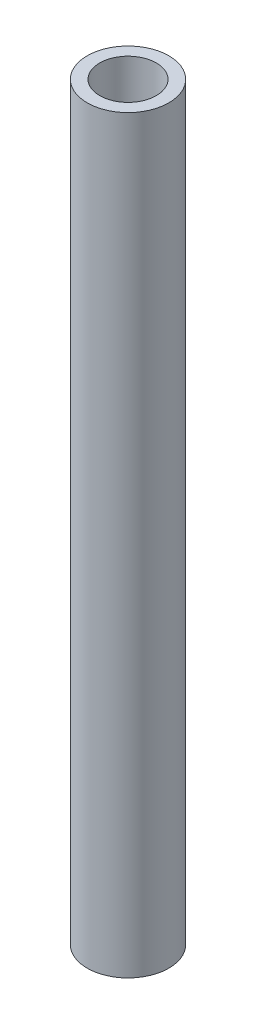
ISO-10303-21;
HEADER;
FILE_DESCRIPTION(('STEP AP214'),'2;1');
FILE_NAME('part.step','',(''),(''),'','','');
FILE_SCHEMA(('AUTOMOTIVE_DESIGN { 1 0 10303 214 1 1 1 1 }'));
ENDSEC;
DATA;
#1=APPLICATION_CONTEXT('core data for automotive mechanical design processes');
#2=APPLICATION_PROTOCOL_DEFINITION('international standard','automotive_design',2000,#1);
#3=PRODUCT_CONTEXT('',#1,'mechanical');
#4=PRODUCT('Part','Part','',(#3));
#5=PRODUCT_RELATED_PRODUCT_CATEGORY('part','',(#4));
#6=PRODUCT_DEFINITION_FORMATION('','',#4);
#7=PRODUCT_DEFINITION_CONTEXT('part definition',#1,'design');
#8=PRODUCT_DEFINITION('design','',#6,#7);
#9=PRODUCT_DEFINITION_SHAPE('','',#8);
#10=(LENGTH_UNIT() NAMED_UNIT(*) SI_UNIT(.MILLI.,.METRE.));
#11=(NAMED_UNIT(*) PLANE_ANGLE_UNIT() SI_UNIT($,.RADIAN.));
#12=(NAMED_UNIT(*) SI_UNIT($,.STERADIAN.) SOLID_ANGLE_UNIT());
#13=UNCERTAINTY_MEASURE_WITH_UNIT(LENGTH_MEASURE(1.E-05),#10,'distance_accuracy_value','');
#14=(GEOMETRIC_REPRESENTATION_CONTEXT(3) GLOBAL_UNCERTAINTY_ASSIGNED_CONTEXT((#13)) GLOBAL_UNIT_ASSIGNED_CONTEXT((#10,
#11,#12)) REPRESENTATION_CONTEXT('',''));
#15=CARTESIAN_POINT('',(0.,0.,0.));
#16=DIRECTION('',(0.,0.,1.));
#17=DIRECTION('',(1.,0.,0.));
#18=AXIS2_PLACEMENT_3D('',#15,#16,#17);
#19=CARTESIAN_POINT('',(0.,152.4,0.));
#20=DIRECTION('',(0.,1.,0.));
#21=DIRECTION('',(0.,0.,1.));
#22=AXIS2_PLACEMENT_3D('',#19,#20,#21);
#23=PLANE('',#22);
#24=CARTESIAN_POINT('',(0.,152.4,0.));
#25=DIRECTION('',(0.,1.,0.));
#26=DIRECTION('',(0.,0.,1.));
#27=AXIS2_PLACEMENT_3D('',#24,#25,#26);
#28=CIRCLE('',#27,16.5989);
#29=CARTESIAN_POINT('',(0.,152.4,-16.5989));
#30=VERTEX_POINT('',#29);
#31=EDGE_CURVE('E10',#30,#30,#28,.T.);
#32=ORIENTED_EDGE('',*,*,#31,.T.);
#33=EDGE_LOOP('',(#32));
#34=FACE_BOUND('',#33,.T.);
#35=CARTESIAN_POINT('',(0.,152.4,0.));
#36=DIRECTION('',(0.,1.,0.));
#37=DIRECTION('',(0.,0.,1.));
#38=AXIS2_PLACEMENT_3D('',#35,#36,#37);
#39=CIRCLE('',#38,11.5189);
#40=CARTESIAN_POINT('',(0.,152.4,-11.5189));
#41=VERTEX_POINT('',#40);
#42=EDGE_CURVE('E41',#41,#41,#39,.T.);
#43=ORIENTED_EDGE('',*,*,#42,.F.);
#44=EDGE_LOOP('',(#43));
#45=FACE_BOUND('',#44,.T.);
#46=ADVANCED_FACE('F30',(#34,#45),#23,.T.);
#47=CARTESIAN_POINT('',(0.,-152.4,0.));
#48=DIRECTION('',(0.,1.,0.));
#49=DIRECTION('',(0.,0.,1.));
#50=AXIS2_PLACEMENT_3D('',#47,#48,#49);
#51=PLANE('',#50);
#52=CARTESIAN_POINT('',(0.,-152.4,0.));
#53=DIRECTION('',(0.,1.,0.));
#54=DIRECTION('',(0.,0.,1.));
#55=AXIS2_PLACEMENT_3D('',#52,#53,#54);
#56=CIRCLE('',#55,16.5989);
#57=CARTESIAN_POINT('',(0.,-152.4,-16.5989));
#58=VERTEX_POINT('',#57);
#59=EDGE_CURVE('E34',#58,#58,#56,.T.);
#60=ORIENTED_EDGE('',*,*,#59,.F.);
#61=EDGE_LOOP('',(#60));
#62=FACE_BOUND('',#61,.T.);
#63=CARTESIAN_POINT('',(0.,-152.4,0.));
#64=DIRECTION('',(0.,1.,0.));
#65=DIRECTION('',(0.,0.,1.));
#66=AXIS2_PLACEMENT_3D('',#63,#64,#65);
#67=CIRCLE('',#66,11.5189);
#68=CARTESIAN_POINT('',(0.,-152.4,-11.5189));
#69=VERTEX_POINT('',#68);
#70=EDGE_CURVE('E43',#69,#69,#67,.T.);
#71=ORIENTED_EDGE('',*,*,#70,.T.);
#72=EDGE_LOOP('',(#71));
#73=FACE_BOUND('',#72,.T.);
#74=ADVANCED_FACE('F53',(#62,#73),#51,.F.);
#75=CARTESIAN_POINT('',(0.,152.4,0.));
#76=DIRECTION('',(0.,-1.,0.));
#77=DIRECTION('',(0.,0.,-1.));
#78=AXIS2_PLACEMENT_3D('',#75,#76,#77);
#79=CYLINDRICAL_SURFACE('',#78,16.5989);
#80=CARTESIAN_POINT('',(0.,152.4,-16.5989));
#81=CARTESIAN_POINT('',(0.,149.225,-16.5989));
#82=CARTESIAN_POINT('',(0.,146.05,-16.5989));
#83=CARTESIAN_POINT('',(0.,139.7,-16.5989));
#84=CARTESIAN_POINT('',(0.,136.525,-16.5989));
#85=CARTESIAN_POINT('',(0.,130.175,-16.5989));
#86=CARTESIAN_POINT('',(0.,127.,-16.5989));
#87=CARTESIAN_POINT('',(0.,120.65,-16.5989));
#88=CARTESIAN_POINT('',(0.,117.475,-16.5989));
#89=CARTESIAN_POINT('',(0.,111.125,-16.5989));
#90=CARTESIAN_POINT('',(0.,107.95,-16.5989));
#91=CARTESIAN_POINT('',(0.,101.6,-16.5989));
#92=CARTESIAN_POINT('',(0.,98.425,-16.5989));
#93=CARTESIAN_POINT('',(0.,92.075,-16.5989));
#94=CARTESIAN_POINT('',(0.,88.9,-16.5989));
#95=CARTESIAN_POINT('',(0.,82.55,-16.5989));
#96=CARTESIAN_POINT('',(0.,79.375,-16.5989));
#97=CARTESIAN_POINT('',(0.,73.025,-16.5989));
#98=CARTESIAN_POINT('',(0.,69.85,-16.5989));
#99=CARTESIAN_POINT('',(0.,63.5,-16.5989));
#100=CARTESIAN_POINT('',(0.,60.325,-16.5989));
#101=CARTESIAN_POINT('',(0.,53.975,-16.5989));
#102=CARTESIAN_POINT('',(0.,50.8,-16.5989));
#103=CARTESIAN_POINT('',(0.,44.45,-16.5989));
#104=CARTESIAN_POINT('',(0.,41.275,-16.5989));
#105=CARTESIAN_POINT('',(0.,34.925,-16.5989));
#106=CARTESIAN_POINT('',(0.,31.75,-16.5989));
#107=CARTESIAN_POINT('',(0.,25.4,-16.5989));
#108=CARTESIAN_POINT('',(0.,22.225,-16.5989));
#109=CARTESIAN_POINT('',(0.,15.875,-16.5989));
#110=CARTESIAN_POINT('',(0.,12.7,-16.5989));
#111=CARTESIAN_POINT('',(0.,6.35,-16.5989));
#112=CARTESIAN_POINT('',(0.,3.175,-16.5989));
#113=CARTESIAN_POINT('',(0.,-3.175,-16.5989));
#114=CARTESIAN_POINT('',(0.,-6.35,-16.5989));
#115=CARTESIAN_POINT('',(0.,-12.7,-16.5989));
#116=CARTESIAN_POINT('',(0.,-15.875,-16.5989));
#117=CARTESIAN_POINT('',(0.,-22.225,-16.5989));
#118=CARTESIAN_POINT('',(0.,-25.4,-16.5989));
#119=CARTESIAN_POINT('',(0.,-31.75,-16.5989));
#120=CARTESIAN_POINT('',(0.,-34.925,-16.5989));
#121=CARTESIAN_POINT('',(0.,-41.275,-16.5989));
#122=CARTESIAN_POINT('',(0.,-44.45,-16.5989));
#123=CARTESIAN_POINT('',(0.,-50.8,-16.5989));
#124=CARTESIAN_POINT('',(0.,-53.975,-16.5989));
#125=CARTESIAN_POINT('',(0.,-60.325,-16.5989));
#126=CARTESIAN_POINT('',(0.,-63.5,-16.5989));
#127=CARTESIAN_POINT('',(0.,-69.85,-16.5989));
#128=CARTESIAN_POINT('',(0.,-73.025,-16.5989));
#129=CARTESIAN_POINT('',(0.,-79.375,-16.5989));
#130=CARTESIAN_POINT('',(0.,-82.55,-16.5989));
#131=CARTESIAN_POINT('',(0.,-88.9,-16.5989));
#132=CARTESIAN_POINT('',(0.,-92.075,-16.5989));
#133=CARTESIAN_POINT('',(0.,-98.425,-16.5989));
#134=CARTESIAN_POINT('',(0.,-101.6,-16.5989));
#135=CARTESIAN_POINT('',(0.,-107.95,-16.5989));
#136=CARTESIAN_POINT('',(0.,-111.125,-16.5989));
#137=CARTESIAN_POINT('',(0.,-117.475,-16.5989));
#138=CARTESIAN_POINT('',(0.,-120.65,-16.5989));
#139=CARTESIAN_POINT('',(0.,-127.,-16.5989));
#140=CARTESIAN_POINT('',(0.,-130.175,-16.5989));
#141=CARTESIAN_POINT('',(0.,-136.525,-16.5989));
#142=CARTESIAN_POINT('',(0.,-139.7,-16.5989));
#143=CARTESIAN_POINT('',(0.,-146.05,-16.5989));
#144=CARTESIAN_POINT('',(0.,-149.225,-16.5989));
#145=CARTESIAN_POINT('',(0.,-152.4,-16.5989));
#146=B_SPLINE_CURVE_WITH_KNOTS('',3,(#80,#81,#82,#83,#84,#85,#86,#87,#88,#89,#90,#91,#92,#93,
#94,#95,#96,#97,#98,#99,#100,#101,#102,#103,#104,#105,#106,#107,#108,#109,#110,#111,#112,#113,
#114,#115,#116,#117,#118,#119,#120,#121,#122,#123,#124,#125,#126,#127,#128,#129,#130,#131,#132,
#133,#134,#135,#136,#137,#138,#139,#140,#141,#142,#143,#144,#145),.UNSPECIFIED.,.F.,.F.,(4,2,2,
2,2,2,2,2,2,2,2,2,2,2,2,2,2,2,2,2,2,2,2,2,2,2,2,2,2,2,2,2,4),(0.,9.52500000000001,19.05,28.575,
38.1,47.625,57.15,66.675,76.2,85.725,95.25,104.775,114.3,123.825,133.35,142.875,152.4,161.925,
171.45,180.975,190.5,200.025,209.55,219.075,228.6,238.125,247.65,257.175,266.7,276.225,285.75,
295.275,304.8),.UNSPECIFIED.);
#147=EDGE_CURVE('BSEAM32',#30,#58,#146,.T.);
#148=ORIENTED_EDGE('',*,*,#31,.F.);
#149=ORIENTED_EDGE('',*,*,#59,.T.);
#150=ORIENTED_EDGE('',*,*,#147,.T.);
#151=ORIENTED_EDGE('',*,*,#147,.F.);
#152=EDGE_LOOP('',(#148,#150,#149,#151));
#153=FACE_BOUND('',#152,.T.);
#154=ADVANCED_FACE('F32',(#153),#79,.T.);
#155=CARTESIAN_POINT('',(0.,152.4,0.));
#156=DIRECTION('',(0.,-1.,0.));
#157=DIRECTION('',(0.,0.,-1.));
#158=AXIS2_PLACEMENT_3D('',#155,#156,#157);
#159=CYLINDRICAL_SURFACE('',#158,11.5189);
#160=CARTESIAN_POINT('',(0.,152.4,-11.5189));
#161=CARTESIAN_POINT('',(0.,149.225,-11.5189));
#162=CARTESIAN_POINT('',(0.,146.05,-11.5189));
#163=CARTESIAN_POINT('',(0.,139.7,-11.5189));
#164=CARTESIAN_POINT('',(0.,136.525,-11.5189));
#165=CARTESIAN_POINT('',(0.,130.175,-11.5189));
#166=CARTESIAN_POINT('',(0.,127.,-11.5189));
#167=CARTESIAN_POINT('',(0.,120.65,-11.5189));
#168=CARTESIAN_POINT('',(0.,117.475,-11.5189));
#169=CARTESIAN_POINT('',(0.,111.125,-11.5189));
#170=CARTESIAN_POINT('',(0.,107.95,-11.5189));
#171=CARTESIAN_POINT('',(0.,101.6,-11.5189));
#172=CARTESIAN_POINT('',(0.,98.425,-11.5189));
#173=CARTESIAN_POINT('',(0.,92.075,-11.5189));
#174=CARTESIAN_POINT('',(0.,88.9,-11.5189));
#175=CARTESIAN_POINT('',(0.,82.55,-11.5189));
#176=CARTESIAN_POINT('',(0.,79.375,-11.5189));
#177=CARTESIAN_POINT('',(0.,73.025,-11.5189));
#178=CARTESIAN_POINT('',(0.,69.85,-11.5189));
#179=CARTESIAN_POINT('',(0.,63.5,-11.5189));
#180=CARTESIAN_POINT('',(0.,60.325,-11.5189));
#181=CARTESIAN_POINT('',(0.,53.975,-11.5189));
#182=CARTESIAN_POINT('',(0.,50.8,-11.5189));
#183=CARTESIAN_POINT('',(0.,44.45,-11.5189));
#184=CARTESIAN_POINT('',(0.,41.275,-11.5189));
#185=CARTESIAN_POINT('',(0.,34.925,-11.5189));
#186=CARTESIAN_POINT('',(0.,31.75,-11.5189));
#187=CARTESIAN_POINT('',(0.,25.4,-11.5189));
#188=CARTESIAN_POINT('',(0.,22.225,-11.5189));
#189=CARTESIAN_POINT('',(0.,15.875,-11.5189));
#190=CARTESIAN_POINT('',(0.,12.7,-11.5189));
#191=CARTESIAN_POINT('',(0.,6.34999999999998,-11.5189));
#192=CARTESIAN_POINT('',(0.,3.17499999999997,-11.5189));
#193=CARTESIAN_POINT('',(0.,-3.17500000000003,-11.5189));
#194=CARTESIAN_POINT('',(0.,-6.35000000000003,-11.5189));
#195=CARTESIAN_POINT('',(0.,-12.7,-11.5189));
#196=CARTESIAN_POINT('',(0.,-15.875,-11.5189));
#197=CARTESIAN_POINT('',(0.,-22.225,-11.5189));
#198=CARTESIAN_POINT('',(0.,-25.4,-11.5189));
#199=CARTESIAN_POINT('',(0.,-31.75,-11.5189));
#200=CARTESIAN_POINT('',(0.,-34.925,-11.5189));
#201=CARTESIAN_POINT('',(0.,-41.275,-11.5189));
#202=CARTESIAN_POINT('',(0.,-44.45,-11.5189));
#203=CARTESIAN_POINT('',(0.,-50.8,-11.5189));
#204=CARTESIAN_POINT('',(0.,-53.975,-11.5189));
#205=CARTESIAN_POINT('',(0.,-60.325,-11.5189));
#206=CARTESIAN_POINT('',(0.,-63.5,-11.5189));
#207=CARTESIAN_POINT('',(0.,-69.85,-11.5189));
#208=CARTESIAN_POINT('',(0.,-73.025,-11.5189));
#209=CARTESIAN_POINT('',(0.,-79.375,-11.5189));
#210=CARTESIAN_POINT('',(0.,-82.5500000000001,-11.5189));
#211=CARTESIAN_POINT('',(0.,-88.9,-11.5189));
#212=CARTESIAN_POINT('',(0.,-92.0750000000001,-11.5189));
#213=CARTESIAN_POINT('',(0.,-98.425,-11.5189));
#214=CARTESIAN_POINT('',(0.,-101.6,-11.5189));
#215=CARTESIAN_POINT('',(0.,-107.95,-11.5189));
#216=CARTESIAN_POINT('',(0.,-111.125,-11.5189));
#217=CARTESIAN_POINT('',(0.,-117.475,-11.5189));
#218=CARTESIAN_POINT('',(0.,-120.65,-11.5189));
#219=CARTESIAN_POINT('',(0.,-127.,-11.5189));
#220=CARTESIAN_POINT('',(0.,-130.175,-11.5189));
#221=CARTESIAN_POINT('',(0.,-136.525,-11.5189));
#222=CARTESIAN_POINT('',(0.,-139.7,-11.5189));
#223=CARTESIAN_POINT('',(0.,-146.05,-11.5189));
#224=CARTESIAN_POINT('',(0.,-149.225,-11.5189));
#225=CARTESIAN_POINT('',(0.,-152.4,-11.5189));
#226=B_SPLINE_CURVE_WITH_KNOTS('',3,(#160,#161,#162,#163,#164,#165,#166,#167,#168,#169,#170,
#171,#172,#173,#174,#175,#176,#177,#178,#179,#180,#181,#182,#183,#184,#185,#186,#187,#188,#189,
#190,#191,#192,#193,#194,#195,#196,#197,#198,#199,#200,#201,#202,#203,#204,#205,#206,#207,#208,
#209,#210,#211,#212,#213,#214,#215,#216,#217,#218,#219,#220,#221,#222,#223,#224,#225),
.UNSPECIFIED.,.F.,.F.,(4,2,2,2,2,2,2,2,2,2,2,2,2,2,2,2,2,2,2,2,2,2,2,2,2,2,2,2,2,2,2,2,4),(0.,
9.52499999999998,19.05,28.575,38.1,47.625,57.15,66.675,76.2,85.725,95.25,104.775,114.3,123.825,
133.35,142.875,152.4,161.925,171.45,180.975,190.5,200.025,209.55,219.075,228.6,238.125,247.65,
257.175,266.7,276.225,285.75,295.275,304.8),.UNSPECIFIED.);
#227=EDGE_CURVE('BSEAM49',#41,#69,#226,.T.);
#228=ORIENTED_EDGE('',*,*,#42,.T.);
#229=ORIENTED_EDGE('',*,*,#70,.F.);
#230=ORIENTED_EDGE('',*,*,#227,.T.);
#231=ORIENTED_EDGE('',*,*,#227,.F.);
#232=EDGE_LOOP('',(#228,#230,#229,#231));
#233=FACE_BOUND('',#232,.T.);
#234=ADVANCED_FACE('F49',(#233),#159,.F.);
#235=CLOSED_SHELL('',(#46,#74,#154,#234));
#236=MANIFOLD_SOLID_BREP('B2',#235);
#237=ADVANCED_BREP_SHAPE_REPRESENTATION('',(#18,#236),#14);
#238=SHAPE_DEFINITION_REPRESENTATION(#9,#237);
ENDSEC;
END-ISO-10303-21;
